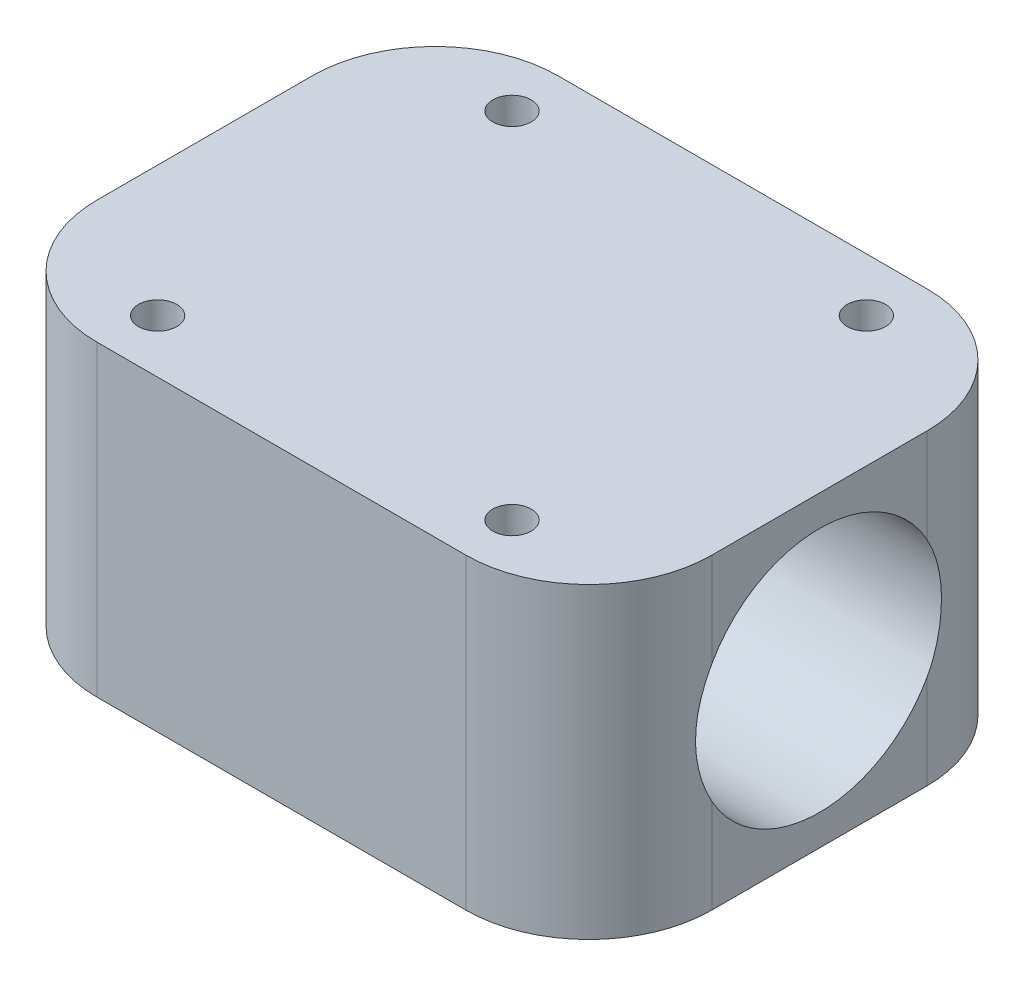
ISO-10303-21;
HEADER;
FILE_DESCRIPTION(('STEP AP214'),'2;1');
FILE_NAME('part.step','',(''),(''),'','','');
FILE_SCHEMA(('AUTOMOTIVE_DESIGN { 1 0 10303 214 1 1 1 1 }'));
ENDSEC;
DATA;
#1=APPLICATION_CONTEXT('core data for automotive mechanical design processes');
#2=APPLICATION_PROTOCOL_DEFINITION('international standard','automotive_design',2000,#1);
#3=PRODUCT_CONTEXT('',#1,'mechanical');
#4=PRODUCT('Part','Part','',(#3));
#5=PRODUCT_RELATED_PRODUCT_CATEGORY('part','',(#4));
#6=PRODUCT_DEFINITION_FORMATION('','',#4);
#7=PRODUCT_DEFINITION_CONTEXT('part definition',#1,'design');
#8=PRODUCT_DEFINITION('design','',#6,#7);
#9=PRODUCT_DEFINITION_SHAPE('','',#8);
#10=(LENGTH_UNIT() NAMED_UNIT(*) SI_UNIT(.MILLI.,.METRE.));
#11=(NAMED_UNIT(*) PLANE_ANGLE_UNIT() SI_UNIT($,.RADIAN.));
#12=(NAMED_UNIT(*) SI_UNIT($,.STERADIAN.) SOLID_ANGLE_UNIT());
#13=UNCERTAINTY_MEASURE_WITH_UNIT(LENGTH_MEASURE(1.E-05),#10,'distance_accuracy_value','');
#14=(GEOMETRIC_REPRESENTATION_CONTEXT(3) GLOBAL_UNCERTAINTY_ASSIGNED_CONTEXT((#13)) GLOBAL_UNIT_ASSIGNED_CONTEXT((#10,
#11,#12)) REPRESENTATION_CONTEXT('',''));
#15=CARTESIAN_POINT('',(0.,0.,0.));
#16=DIRECTION('',(0.,0.,1.));
#17=DIRECTION('',(1.,0.,0.));
#18=AXIS2_PLACEMENT_3D('',#15,#16,#17);
#19=CARTESIAN_POINT('',(-20.,20.,-6.99999999999995));
#20=DIRECTION('',(1.,0.,0.));
#21=DIRECTION('',(0.,0.,-1.));
#22=AXIS2_PLACEMENT_3D('',#19,#20,#21);
#23=PLANE('',#22);
#24=DIRECTION('',(0.,-1.,0.));
#25=VECTOR('',#24,1.);
#26=CARTESIAN_POINT('',(-20.,20.,-6.99999999999995));
#27=LINE('',#26,#25);
#28=CARTESIAN_POINT('',(-20.,20.,-6.99999999999995));
#29=VERTEX_POINT('',#28);
#30=CARTESIAN_POINT('',(-20.,13.8729833462075,-6.99999999999995));
#31=VERTEX_POINT('',#30);
#32=EDGE_CURVE('E139',#29,#31,#27,.T.);
#33=ORIENTED_EDGE('',*,*,#32,.T.);
#34=CARTESIAN_POINT('',(-20.,10.,0.));
#35=DIRECTION('',(1.,0.,0.));
#36=DIRECTION('',(0.,0.,-1.));
#37=AXIS2_PLACEMENT_3D('',#34,#35,#36);
#38=CIRCLE('',#37,8.);
#39=CARTESIAN_POINT('',(-20.,13.8729833462074,6.99999999999999));
#40=VERTEX_POINT('',#39);
#41=EDGE_CURVE('E124',#31,#40,#38,.T.);
#42=ORIENTED_EDGE('',*,*,#41,.T.);
#43=DIRECTION('',(0.,-1.,0.));
#44=VECTOR('',#43,1.);
#45=CARTESIAN_POINT('',(-20.,20.,6.99999999999994));
#46=LINE('',#45,#44);
#47=CARTESIAN_POINT('',(-20.,20.,6.99999999999994));
#48=VERTEX_POINT('',#47);
#49=EDGE_CURVE('E150',#48,#40,#46,.T.);
#50=ORIENTED_EDGE('',*,*,#49,.F.);
#51=DIRECTION('',(0.,0.,1.));
#52=VECTOR('',#51,1.);
#53=CARTESIAN_POINT('',(-20.,20.,-6.99999999999995));
#54=LINE('',#53,#52);
#55=EDGE_CURVE('E145',#29,#48,#54,.T.);
#56=ORIENTED_EDGE('',*,*,#55,.F.);
#57=EDGE_LOOP('',(#33,#42,#50,#56));
#58=FACE_BOUND('',#57,.T.);
#59=ADVANCED_FACE('F37',(#58),#23,.F.);
#60=CARTESIAN_POINT('',(20.,20.,-6.99999999999995));
#61=DIRECTION('',(-1.,0.,0.));
#62=DIRECTION('',(0.,0.,1.));
#63=AXIS2_PLACEMENT_3D('',#60,#61,#62);
#64=PLANE('',#63);
#65=DIRECTION('',(0.,-1.,0.));
#66=VECTOR('',#65,1.);
#67=CARTESIAN_POINT('',(20.,20.,6.99999999999994));
#68=LINE('',#67,#66);
#69=CARTESIAN_POINT('',(20.,20.,6.99999999999994));
#70=VERTEX_POINT('',#69);
#71=CARTESIAN_POINT('',(20.,13.8729833462075,6.99999999999994));
#72=VERTEX_POINT('',#71);
#73=EDGE_CURVE('E201',#70,#72,#68,.T.);
#74=ORIENTED_EDGE('',*,*,#73,.T.);
#75=CARTESIAN_POINT('',(20.,10.,0.));
#76=DIRECTION('',(1.,0.,0.));
#77=DIRECTION('',(0.,0.,-1.));
#78=AXIS2_PLACEMENT_3D('',#75,#76,#77);
#79=CIRCLE('',#78,8.);
#80=CARTESIAN_POINT('',(20.,13.8729833462075,-6.99999999999995));
#81=VERTEX_POINT('',#80);
#82=EDGE_CURVE('E235',#81,#72,#79,.T.);
#83=ORIENTED_EDGE('',*,*,#82,.F.);
#84=DIRECTION('',(0.,-1.,0.));
#85=VECTOR('',#84,1.);
#86=CARTESIAN_POINT('',(20.,20.,-6.99999999999995));
#87=LINE('',#86,#85);
#88=CARTESIAN_POINT('',(20.,20.,-6.99999999999995));
#89=VERTEX_POINT('',#88);
#90=EDGE_CURVE('E198',#89,#81,#87,.T.);
#91=ORIENTED_EDGE('',*,*,#90,.F.);
#92=DIRECTION('',(0.,0.,-1.));
#93=VECTOR('',#92,1.);
#94=CARTESIAN_POINT('',(20.,20.,-6.99999999999995));
#95=LINE('',#94,#93);
#96=EDGE_CURVE('E181',#70,#89,#95,.T.);
#97=ORIENTED_EDGE('',*,*,#96,.F.);
#98=EDGE_LOOP('',(#74,#83,#91,#97));
#99=FACE_BOUND('',#98,.T.);
#100=ADVANCED_FACE('F234',(#99),#64,.F.);
#101=CARTESIAN_POINT('',(12.,20.,-7.00000000000001));
#102=DIRECTION('',(0.,-1.,0.));
#103=DIRECTION('',(0.,0.,-1.));
#104=AXIS2_PLACEMENT_3D('',#101,#102,#103);
#105=PLANE('',#104);
#106=CARTESIAN_POINT('',(12.,20.,-7.00000000000001));
#107=DIRECTION('',(0.,1.,0.));
#108=DIRECTION('',(0.,0.,-1.));
#109=AXIS2_PLACEMENT_3D('',#106,#107,#108);
#110=CIRCLE('',#109,8.);
#111=CARTESIAN_POINT('',(11.9999999999999,20.,-15.));
#112=VERTEX_POINT('',#111);
#113=EDGE_CURVE('E197',#89,#112,#110,.T.);
#114=ORIENTED_EDGE('',*,*,#113,.T.);
#115=DIRECTION('',(-1.,0.,0.));
#116=VECTOR('',#115,1.);
#117=CARTESIAN_POINT('',(-11.9999999999999,20.,-15.));
#118=LINE('',#117,#116);
#119=CARTESIAN_POINT('',(-11.9999999999999,20.,-15.));
#120=VERTEX_POINT('',#119);
#121=EDGE_CURVE('E160',#112,#120,#118,.T.);
#122=ORIENTED_EDGE('',*,*,#121,.T.);
#123=CARTESIAN_POINT('',(-12.,20.,-7.00000000000001));
#124=DIRECTION('',(0.,1.,0.));
#125=DIRECTION('',(0.,0.,1.));
#126=AXIS2_PLACEMENT_3D('',#123,#124,#125);
#127=CIRCLE('',#126,8.);
#128=EDGE_CURVE('E223',#120,#29,#127,.T.);
#129=ORIENTED_EDGE('',*,*,#128,.T.);
#130=ORIENTED_EDGE('',*,*,#55,.T.);
#131=CARTESIAN_POINT('',(-12.,20.,6.99999999999999));
#132=DIRECTION('',(0.,1.,0.));
#133=DIRECTION('',(0.,0.,1.));
#134=AXIS2_PLACEMENT_3D('',#131,#132,#133);
#135=CIRCLE('',#134,8.);
#136=CARTESIAN_POINT('',(-12.,20.,15.));
#137=VERTEX_POINT('',#136);
#138=EDGE_CURVE('E217',#48,#137,#135,.T.);
#139=ORIENTED_EDGE('',*,*,#138,.T.);
#140=DIRECTION('',(1.,0.,0.));
#141=VECTOR('',#140,1.);
#142=CARTESIAN_POINT('',(-11.9999999999999,20.,15.));
#143=LINE('',#142,#141);
#144=CARTESIAN_POINT('',(12.,20.,15.));
#145=VERTEX_POINT('',#144);
#146=EDGE_CURVE('E219',#137,#145,#143,.T.);
#147=ORIENTED_EDGE('',*,*,#146,.T.);
#148=CARTESIAN_POINT('',(12.,20.,6.99999999999999));
#149=DIRECTION('',(0.,1.,0.));
#150=DIRECTION('',(0.,0.,1.));
#151=AXIS2_PLACEMENT_3D('',#148,#149,#150);
#152=CIRCLE('',#151,8.);
#153=EDGE_CURVE('E221',#145,#70,#152,.T.);
#154=ORIENTED_EDGE('',*,*,#153,.T.);
#155=ORIENTED_EDGE('',*,*,#96,.T.);
#156=EDGE_LOOP('',(#114,#122,#129,#130,#139,#147,#154,#155));
#157=FACE_BOUND('',#156,.T.);
#158=CARTESIAN_POINT('',(-11.5258405333407,20.,-11.5258405333407));
#159=DIRECTION('',(0.,1.,0.));
#160=DIRECTION('',(0.,0.,1.));
#161=AXIS2_PLACEMENT_3D('',#158,#159,#160);
#162=CIRCLE('',#161,1.25);
#163=CARTESIAN_POINT('',(-11.5258405333407,20.,-10.2758405333407));
#164=VERTEX_POINT('',#163);
#165=EDGE_CURVE('E173',#164,#164,#162,.T.);
#166=ORIENTED_EDGE('',*,*,#165,.F.);
#167=EDGE_LOOP('',(#166));
#168=FACE_BOUND('',#167,.T.);
#169=CARTESIAN_POINT('',(11.5258405333407,20.,-11.5258405333407));
#170=DIRECTION('',(0.,1.,0.));
#171=DIRECTION('',(0.,0.,1.));
#172=AXIS2_PLACEMENT_3D('',#169,#170,#171);
#173=CIRCLE('',#172,1.25);
#174=CARTESIAN_POINT('',(11.5258405333407,20.,-10.2758405333407));
#175=VERTEX_POINT('',#174);
#176=EDGE_CURVE('E327',#175,#175,#173,.T.);
#177=ORIENTED_EDGE('',*,*,#176,.F.);
#178=EDGE_LOOP('',(#177));
#179=FACE_BOUND('',#178,.T.);
#180=CARTESIAN_POINT('',(11.5258405333407,20.,11.5258405333407));
#181=DIRECTION('',(0.,1.,0.));
#182=DIRECTION('',(0.,0.,1.));
#183=AXIS2_PLACEMENT_3D('',#180,#181,#182);
#184=CIRCLE('',#183,1.25);
#185=CARTESIAN_POINT('',(11.5258405333407,20.,12.7758405333407));
#186=VERTEX_POINT('',#185);
#187=EDGE_CURVE('E321',#186,#186,#184,.T.);
#188=ORIENTED_EDGE('',*,*,#187,.F.);
#189=EDGE_LOOP('',(#188));
#190=FACE_BOUND('',#189,.T.);
#191=CARTESIAN_POINT('',(-11.5258405333407,20.,11.5258405333407));
#192=DIRECTION('',(0.,1.,0.));
#193=DIRECTION('',(0.,0.,1.));
#194=AXIS2_PLACEMENT_3D('',#191,#192,#193);
#195=CIRCLE('',#194,1.25);
#196=CARTESIAN_POINT('',(-11.5258405333407,20.,12.7758405333407));
#197=VERTEX_POINT('',#196);
#198=EDGE_CURVE('E314',#197,#197,#195,.T.);
#199=ORIENTED_EDGE('',*,*,#198,.F.);
#200=EDGE_LOOP('',(#199));
#201=FACE_BOUND('',#200,.T.);
#202=ADVANCED_FACE('F230',(#157,#168,#179,#190,#201),#105,.F.);
#203=CARTESIAN_POINT('',(12.,0.,-7.00000000000001));
#204=DIRECTION('',(0.,-1.,0.));
#205=DIRECTION('',(0.,0.,-1.));
#206=AXIS2_PLACEMENT_3D('',#203,#204,#205);
#207=PLANE('',#206);
#208=CARTESIAN_POINT('',(11.5258405333407,0.,11.5258405333407));
#209=DIRECTION('',(0.,1.,0.));
#210=DIRECTION('',(0.,0.,1.));
#211=AXIS2_PLACEMENT_3D('',#208,#209,#210);
#212=CIRCLE('',#211,1.25);
#213=CARTESIAN_POINT('',(11.5258405333407,0.,12.7758405333407));
#214=VERTEX_POINT('',#213);
#215=EDGE_CURVE('E319',#214,#214,#212,.T.);
#216=ORIENTED_EDGE('',*,*,#215,.T.);
#217=EDGE_LOOP('',(#216));
#218=FACE_BOUND('',#217,.T.);
#219=CARTESIAN_POINT('',(-11.5258405333407,0.,-11.5258405333407));
#220=DIRECTION('',(0.,1.,0.));
#221=DIRECTION('',(0.,0.,1.));
#222=AXIS2_PLACEMENT_3D('',#219,#220,#221);
#223=CIRCLE('',#222,1.25);
#224=CARTESIAN_POINT('',(-11.5258405333407,0.,-10.2758405333407));
#225=VERTEX_POINT('',#224);
#226=EDGE_CURVE('E178',#225,#225,#223,.T.);
#227=ORIENTED_EDGE('',*,*,#226,.T.);
#228=EDGE_LOOP('',(#227));
#229=FACE_BOUND('',#228,.T.);
#230=CARTESIAN_POINT('',(12.,0.,-7.00000000000001));
#231=DIRECTION('',(0.,1.,0.));
#232=DIRECTION('',(0.,0.,-1.));
#233=AXIS2_PLACEMENT_3D('',#230,#231,#232);
#234=CIRCLE('',#233,8.);
#235=CARTESIAN_POINT('',(20.,0.,-6.99999999999995));
#236=VERTEX_POINT('',#235);
#237=CARTESIAN_POINT('',(11.9999999999999,0.,-15.));
#238=VERTEX_POINT('',#237);
#239=EDGE_CURVE('E165',#236,#238,#234,.T.);
#240=ORIENTED_EDGE('',*,*,#239,.F.);
#241=DIRECTION('',(0.,0.,-1.));
#242=VECTOR('',#241,1.);
#243=CARTESIAN_POINT('',(20.,0.,-6.99999999999995));
#244=LINE('',#243,#242);
#245=CARTESIAN_POINT('',(20.,0.,6.99999999999994));
#246=VERTEX_POINT('',#245);
#247=EDGE_CURVE('E195',#246,#236,#244,.T.);
#248=ORIENTED_EDGE('',*,*,#247,.F.);
#249=CARTESIAN_POINT('',(12.,0.,6.99999999999999));
#250=DIRECTION('',(0.,1.,0.));
#251=DIRECTION('',(0.,0.,1.));
#252=AXIS2_PLACEMENT_3D('',#249,#250,#251);
#253=CIRCLE('',#252,8.);
#254=CARTESIAN_POINT('',(12.,0.,15.));
#255=VERTEX_POINT('',#254);
#256=EDGE_CURVE('E192',#255,#246,#253,.T.);
#257=ORIENTED_EDGE('',*,*,#256,.F.);
#258=DIRECTION('',(1.,0.,0.));
#259=VECTOR('',#258,1.);
#260=CARTESIAN_POINT('',(-11.9999999999999,0.,15.));
#261=LINE('',#260,#259);
#262=CARTESIAN_POINT('',(-12.,0.,15.));
#263=VERTEX_POINT('',#262);
#264=EDGE_CURVE('E190',#263,#255,#261,.T.);
#265=ORIENTED_EDGE('',*,*,#264,.F.);
#266=CARTESIAN_POINT('',(-12.,0.,6.99999999999999));
#267=DIRECTION('',(0.,1.,0.));
#268=DIRECTION('',(0.,0.,1.));
#269=AXIS2_PLACEMENT_3D('',#266,#267,#268);
#270=CIRCLE('',#269,8.);
#271=CARTESIAN_POINT('',(-20.,0.,6.99999999999994));
#272=VERTEX_POINT('',#271);
#273=EDGE_CURVE('E188',#272,#263,#270,.T.);
#274=ORIENTED_EDGE('',*,*,#273,.F.);
#275=DIRECTION('',(0.,0.,1.));
#276=VECTOR('',#275,1.);
#277=CARTESIAN_POINT('',(-20.,0.,-6.99999999999995));
#278=LINE('',#277,#276);
#279=CARTESIAN_POINT('',(-20.,0.,-6.99999999999995));
#280=VERTEX_POINT('',#279);
#281=EDGE_CURVE('E185',#280,#272,#278,.T.);
#282=ORIENTED_EDGE('',*,*,#281,.F.);
#283=CARTESIAN_POINT('',(-12.,0.,-7.00000000000001));
#284=DIRECTION('',(0.,1.,0.));
#285=DIRECTION('',(0.,0.,1.));
#286=AXIS2_PLACEMENT_3D('',#283,#284,#285);
#287=CIRCLE('',#286,8.);
#288=CARTESIAN_POINT('',(-11.9999999999999,0.,-15.));
#289=VERTEX_POINT('',#288);
#290=EDGE_CURVE('E175',#289,#280,#287,.T.);
#291=ORIENTED_EDGE('',*,*,#290,.F.);
#292=DIRECTION('',(-1.,0.,0.));
#293=VECTOR('',#292,1.);
#294=CARTESIAN_POINT('',(-11.9999999999999,0.,-15.));
#295=LINE('',#294,#293);
#296=EDGE_CURVE('E159',#238,#289,#295,.T.);
#297=ORIENTED_EDGE('',*,*,#296,.F.);
#298=EDGE_LOOP('',(#240,#248,#257,#265,#274,#282,#291,#297));
#299=FACE_BOUND('',#298,.T.);
#300=CARTESIAN_POINT('',(11.5258405333407,0.,-11.5258405333407));
#301=DIRECTION('',(0.,1.,0.));
#302=DIRECTION('',(0.,0.,1.));
#303=AXIS2_PLACEMENT_3D('',#300,#301,#302);
#304=CIRCLE('',#303,1.25);
#305=CARTESIAN_POINT('',(11.5258405333407,0.,-10.2758405333407));
#306=VERTEX_POINT('',#305);
#307=EDGE_CURVE('E324',#306,#306,#304,.T.);
#308=ORIENTED_EDGE('',*,*,#307,.T.);
#309=EDGE_LOOP('',(#308));
#310=FACE_BOUND('',#309,.T.);
#311=CARTESIAN_POINT('',(-11.5258405333407,0.,11.5258405333407));
#312=DIRECTION('',(0.,1.,0.));
#313=DIRECTION('',(0.,0.,1.));
#314=AXIS2_PLACEMENT_3D('',#311,#312,#313);
#315=CIRCLE('',#314,1.25);
#316=CARTESIAN_POINT('',(-11.5258405333407,0.,12.7758405333407));
#317=VERTEX_POINT('',#316);
#318=EDGE_CURVE('E312',#317,#317,#315,.T.);
#319=ORIENTED_EDGE('',*,*,#318,.T.);
#320=EDGE_LOOP('',(#319));
#321=FACE_BOUND('',#320,.T.);
#322=ADVANCED_FACE('F241',(#218,#229,#299,#310,#321),#207,.T.);
#323=CARTESIAN_POINT('',(12.,20.,-7.00000000000001));
#324=DIRECTION('',(0.,-1.,0.));
#325=DIRECTION('',(0.,0.,-1.));
#326=AXIS2_PLACEMENT_3D('',#323,#324,#325);
#327=CYLINDRICAL_SURFACE('',#326,8.);
#328=ORIENTED_EDGE('',*,*,#90,.T.);
#329=CARTESIAN_POINT('',(20.,13.8729833462075,-6.99999999999995));
#330=CARTESIAN_POINT('',(19.999955125017,13.6763221820204,-7.10883612041854));
#331=CARTESIAN_POINT('',(19.9977768995966,13.4750774520624,-7.20933000196342));
#332=CARTESIAN_POINT('',(19.9908807909294,13.064905879238,-7.39301974211418));
#333=CARTESIAN_POINT('',(19.9861631768253,12.8559798526767,-7.47621743259982));
#334=CARTESIAN_POINT('',(19.9759228974455,12.4322320696692,-7.62460422395473));
#335=CARTESIAN_POINT('',(19.9704015493122,12.2174204172454,-7.68982229290339));
#336=CARTESIAN_POINT('',(19.9599000354582,11.7830647384255,-7.80198581717139));
#337=CARTESIAN_POINT('',(19.9549198675169,11.5635207314506,-7.84893134746511));
#338=CARTESIAN_POINT('',(19.9465215160614,11.1210352182704,-7.92424713358336));
#339=CARTESIAN_POINT('',(19.9431047356728,10.8980908449444,-7.95260071314983));
#340=CARTESIAN_POINT('',(19.9384735134743,10.4505820689764,-7.99045675307186));
#341=CARTESIAN_POINT('',(19.9372590819675,10.2260176587603,-7.99995912523675));
#342=CARTESIAN_POINT('',(19.9372488175885,9.77688484423645,-8.00004061149689));
#343=CARTESIAN_POINT('',(19.9384529899331,9.55231643992103,-7.99061968477456));
#344=CARTESIAN_POINT('',(19.9430655380601,9.1047927305723,-7.95292585001845));
#345=CARTESIAN_POINT('',(19.9464739045844,8.88183741876765,-7.92465302116658));
#346=CARTESIAN_POINT('',(19.9548635509727,8.43908693712663,-7.84945721346348));
#347=CARTESIAN_POINT('',(19.9598451011367,8.21929231714197,-7.80253102928504));
#348=CARTESIAN_POINT('',(19.970354503264,7.78444047828594,-7.69036567952335));
#349=CARTESIAN_POINT('',(19.9758823581224,7.5693832845276,-7.62512641688798));
#350=CARTESIAN_POINT('',(19.9861373506157,7.14515232911403,-7.47665712877295));
#351=CARTESIAN_POINT('',(19.9908631667068,6.93598874241325,-7.39339791503544));
#352=CARTESIAN_POINT('',(19.9977720852807,6.52535728497314,-7.20954713890403));
#353=CARTESIAN_POINT('',(19.9999549205315,6.32389022518368,-7.10895375620331));
#354=CARTESIAN_POINT('',(20.,6.12701665379248,-6.99999999999995));
#355=B_SPLINE_CURVE_WITH_KNOTS('',3,(#329,#330,#331,#332,#333,#334,#335,#336,#337,#338,#339,
#340,#341,#342,#343,#344,#345,#346,#347,#348,#349,#350,#351,#352,#353,#354),.UNSPECIFIED.,.F.,
.F.,(4,2,2,2,2,2,2,2,2,2,2,2,4),(0.,0.674057468568093,1.34804350973321,2.02093721826604,
2.69382816580739,3.3673218477823,4.04081868052177,4.71431696599638,5.38781242265633,
6.06142366047946,6.73503846824525,7.40975265678092,8.08453774206085),.UNSPECIFIED.);
#356=CARTESIAN_POINT('',(20.,6.12701665379248,-6.99999999999995));
#357=VERTEX_POINT('',#356);
#358=EDGE_CURVE('E143',#81,#357,#355,.T.);
#359=ORIENTED_EDGE('',*,*,#358,.T.);
#360=EDGE_CURVE('E169',#357,#236,#87,.T.);
#361=ORIENTED_EDGE('',*,*,#360,.T.);
#362=ORIENTED_EDGE('',*,*,#239,.T.);
#363=DIRECTION('',(0.,-1.,0.));
#364=VECTOR('',#363,1.);
#365=CARTESIAN_POINT('',(11.9999999999999,20.,-15.));
#366=LINE('',#365,#364);
#367=EDGE_CURVE('E46',#112,#238,#366,.T.);
#368=ORIENTED_EDGE('',*,*,#367,.F.);
#369=ORIENTED_EDGE('',*,*,#113,.F.);
#370=EDGE_LOOP('',(#328,#359,#361,#362,#368,#369));
#371=FACE_BOUND('',#370,.T.);
#372=ADVANCED_FACE('F39',(#371),#327,.T.);
#373=CARTESIAN_POINT('',(-11.9999999999999,20.,-15.));
#374=DIRECTION('',(0.,0.,1.));
#375=DIRECTION('',(1.,0.,0.));
#376=AXIS2_PLACEMENT_3D('',#373,#374,#375);
#377=PLANE('',#376);
#378=ORIENTED_EDGE('',*,*,#296,.T.);
#379=DIRECTION('',(0.,-1.,0.));
#380=VECTOR('',#379,1.);
#381=CARTESIAN_POINT('',(-11.9999999999999,20.,-15.));
#382=LINE('',#381,#380);
#383=EDGE_CURVE('E146',#120,#289,#382,.T.);
#384=ORIENTED_EDGE('',*,*,#383,.F.);
#385=ORIENTED_EDGE('',*,*,#121,.F.);
#386=ORIENTED_EDGE('',*,*,#367,.T.);
#387=EDGE_LOOP('',(#378,#384,#385,#386));
#388=FACE_BOUND('',#387,.T.);
#389=ADVANCED_FACE('F157',(#388),#377,.F.);
#390=CARTESIAN_POINT('',(-12.,20.,-7.00000000000001));
#391=DIRECTION('',(0.,-1.,0.));
#392=DIRECTION('',(0.,0.,-1.));
#393=AXIS2_PLACEMENT_3D('',#390,#391,#392);
#394=CYLINDRICAL_SURFACE('',#393,8.);
#395=CARTESIAN_POINT('',(-20.,6.1270166537925,-6.99999999999995));
#396=VERTEX_POINT('',#395);
#397=EDGE_CURVE('E142',#396,#280,#27,.T.);
#398=ORIENTED_EDGE('',*,*,#397,.F.);
#399=CARTESIAN_POINT('',(-20.,6.12701665379249,-6.99999999999995));
#400=CARTESIAN_POINT('',(-19.9999551250169,6.32367781797963,-7.10883612041854));
#401=CARTESIAN_POINT('',(-19.9977768995966,6.52492254793763,-7.20933000196342));
#402=CARTESIAN_POINT('',(-19.9908807909294,6.93509412076203,-7.39301974211418));
#403=CARTESIAN_POINT('',(-19.9861631768252,7.1440201473233,-7.47621743259982));
#404=CARTESIAN_POINT('',(-19.9759228974455,7.56776793033085,-7.62460422395473));
#405=CARTESIAN_POINT('',(-19.9704015493122,7.7825795827546,-7.68982229290339));
#406=CARTESIAN_POINT('',(-19.9599000354581,8.21693526157455,-7.80198581717138));
#407=CARTESIAN_POINT('',(-19.9549198675169,8.43647926854943,-7.84893134746511));
#408=CARTESIAN_POINT('',(-19.9465215160614,8.87896478172956,-7.92424713358335));
#409=CARTESIAN_POINT('',(-19.9431047356728,9.10190915505558,-7.95260071314982));
#410=CARTESIAN_POINT('',(-19.9384735134743,9.54941793102363,-7.99045675307186));
#411=CARTESIAN_POINT('',(-19.9372590819675,9.77398234123967,-7.99995912523675));
#412=CARTESIAN_POINT('',(-19.9372488175885,10.2231151557636,-8.00004061149689));
#413=CARTESIAN_POINT('',(-19.9384529899331,10.447683560079,-7.99061968477455));
#414=CARTESIAN_POINT('',(-19.9430655380601,10.8952072694277,-7.95292585001845));
#415=CARTESIAN_POINT('',(-19.9464739045844,11.1181625812324,-7.92465302116658));
#416=CARTESIAN_POINT('',(-19.9548635509727,11.5609130628734,-7.84945721346348));
#417=CARTESIAN_POINT('',(-19.9598451011367,11.780707682858,-7.80253102928503));
#418=CARTESIAN_POINT('',(-19.970354503264,12.2155595217141,-7.69036567952335));
#419=CARTESIAN_POINT('',(-19.9758823581224,12.4306167154724,-7.62512641688797));
#420=CARTESIAN_POINT('',(-19.9861373506157,12.854847670886,-7.47665712877294));
#421=CARTESIAN_POINT('',(-19.9908631667068,13.0640112575867,-7.39339791503543));
#422=CARTESIAN_POINT('',(-19.9977720852807,13.4746427150269,-7.20954713890403));
#423=CARTESIAN_POINT('',(-19.9999549205315,13.6761097748163,-7.10895375620331));
#424=CARTESIAN_POINT('',(-20.,13.8729833462075,-6.99999999999995));
#425=B_SPLINE_CURVE_WITH_KNOTS('',3,(#399,#400,#401,#402,#403,#404,#405,#406,#407,#408,#409,
#410,#411,#412,#413,#414,#415,#416,#417,#418,#419,#420,#421,#422,#423,#424),.UNSPECIFIED.,.F.,
.F.,(4,2,2,2,2,2,2,2,2,2,2,2,4),(0.,0.674057468568091,1.34804350973321,2.02093721826604,
2.69382816580739,3.3673218477823,4.04081868052177,4.71431696599638,5.38781242265632,
6.06142366047945,6.73503846824524,7.4097526567809,8.08453774206083),.UNSPECIFIED.);
#426=EDGE_CURVE('E127',#396,#31,#425,.T.);
#427=ORIENTED_EDGE('',*,*,#426,.T.);
#428=ORIENTED_EDGE('',*,*,#32,.F.);
#429=ORIENTED_EDGE('',*,*,#128,.F.);
#430=ORIENTED_EDGE('',*,*,#383,.T.);
#431=ORIENTED_EDGE('',*,*,#290,.T.);
#432=EDGE_LOOP('',(#398,#427,#428,#429,#430,#431));
#433=FACE_BOUND('',#432,.T.);
#434=ADVANCED_FACE('F137',(#433),#394,.T.);
#435=CARTESIAN_POINT('',(-20.,6.12701665379257,6.99999999999994));
#436=VERTEX_POINT('',#435);
#437=EDGE_CURVE('E208',#436,#272,#46,.T.);
#438=ORIENTED_EDGE('',*,*,#437,.F.);
#439=EDGE_CURVE('E53',#436,#396,#38,.T.);
#440=ORIENTED_EDGE('',*,*,#439,.T.);
#441=ORIENTED_EDGE('',*,*,#397,.T.);
#442=ORIENTED_EDGE('',*,*,#281,.T.);
#443=EDGE_LOOP('',(#438,#440,#441,#442));
#444=FACE_BOUND('',#443,.T.);
#445=ADVANCED_FACE('F245',(#444),#23,.F.);
#446=CARTESIAN_POINT('',(-12.,20.,6.99999999999999));
#447=DIRECTION('',(0.,-1.,0.));
#448=DIRECTION('',(0.,0.,-1.));
#449=AXIS2_PLACEMENT_3D('',#446,#447,#448);
#450=CYLINDRICAL_SURFACE('',#449,8.);
#451=ORIENTED_EDGE('',*,*,#49,.T.);
#452=CARTESIAN_POINT('',(-20.,13.8729833462075,6.99999999999994));
#453=CARTESIAN_POINT('',(-19.9999551250169,13.6763221820204,7.10883612041853));
#454=CARTESIAN_POINT('',(-19.9977768995966,13.4750774520624,7.20933000196341));
#455=CARTESIAN_POINT('',(-19.9908807909294,13.064905879238,7.39301974211417));
#456=CARTESIAN_POINT('',(-19.9861631768252,12.8559798526767,7.47621743259981));
#457=CARTESIAN_POINT('',(-19.9759228974455,12.4322320696692,7.62460422395472));
#458=CARTESIAN_POINT('',(-19.9704015493122,12.2174204172454,7.68982229290338));
#459=CARTESIAN_POINT('',(-19.9599000354581,11.7830647384255,7.80198581717138));
#460=CARTESIAN_POINT('',(-19.9549198675169,11.5635207314506,7.8489313474651));
#461=CARTESIAN_POINT('',(-19.9465215160614,11.1210352182705,7.92424713358334));
#462=CARTESIAN_POINT('',(-19.9431047356728,10.8980908449444,7.95260071314982));
#463=CARTESIAN_POINT('',(-19.9384735134743,10.4505820689764,7.99045675307185));
#464=CARTESIAN_POINT('',(-19.9372590819675,10.2260176587604,7.99995912523675));
#465=CARTESIAN_POINT('',(-19.9372488175884,9.77688484423647,8.00004061149689));
#466=CARTESIAN_POINT('',(-19.9384529899331,9.55231643992105,7.99061968477455));
#467=CARTESIAN_POINT('',(-19.9430655380601,9.10479273057232,7.95292585001844));
#468=CARTESIAN_POINT('',(-19.9464739045844,8.88183741876767,7.92465302116657));
#469=CARTESIAN_POINT('',(-19.9548635509726,8.43908693712665,7.84945721346348));
#470=CARTESIAN_POINT('',(-19.9598451011367,8.21929231714198,7.80253102928503));
#471=CARTESIAN_POINT('',(-19.970354503264,7.78444047828595,7.69036567952335));
#472=CARTESIAN_POINT('',(-19.9758823581224,7.56938328452761,7.62512641688797));
#473=CARTESIAN_POINT('',(-19.9861373506157,7.14515232911403,7.47665712877294));
#474=CARTESIAN_POINT('',(-19.9908631667068,6.93598874241325,7.39339791503543));
#475=CARTESIAN_POINT('',(-19.9977720852807,6.52535728497313,7.20954713890402));
#476=CARTESIAN_POINT('',(-19.9999549205314,6.32389022518368,7.1089537562033));
#477=CARTESIAN_POINT('',(-20.,6.12701665379247,6.99999999999994));
#478=B_SPLINE_CURVE_WITH_KNOTS('',3,(#452,#453,#454,#455,#456,#457,#458,#459,#460,#461,#462,
#463,#464,#465,#466,#467,#468,#469,#470,#471,#472,#473,#474,#475,#476,#477),.UNSPECIFIED.,.F.,
.F.,(4,2,2,2,2,2,2,2,2,2,2,2,4),(0.,0.674057468568094,1.34804350973321,2.02093721826604,
2.69382816580739,3.36732184778229,4.04081868052177,4.71431696599638,5.38781242265632,
6.06142366047947,6.73503846824526,7.40975265678094,8.08453774206087),.UNSPECIFIED.);
#479=EDGE_CURVE('E128',#40,#436,#478,.T.);
#480=ORIENTED_EDGE('',*,*,#479,.T.);
#481=ORIENTED_EDGE('',*,*,#437,.T.);
#482=ORIENTED_EDGE('',*,*,#273,.T.);
#483=DIRECTION('',(0.,-1.,0.));
#484=VECTOR('',#483,1.);
#485=CARTESIAN_POINT('',(-12.,20.,15.));
#486=LINE('',#485,#484);
#487=EDGE_CURVE('E206',#137,#263,#486,.T.);
#488=ORIENTED_EDGE('',*,*,#487,.F.);
#489=ORIENTED_EDGE('',*,*,#138,.F.);
#490=EDGE_LOOP('',(#451,#480,#481,#482,#488,#489));
#491=FACE_BOUND('',#490,.T.);
#492=ADVANCED_FACE('F216',(#491),#450,.T.);
#493=CARTESIAN_POINT('',(-11.9999999999999,20.,15.));
#494=DIRECTION('',(0.,0.,-1.));
#495=DIRECTION('',(-1.,0.,0.));
#496=AXIS2_PLACEMENT_3D('',#493,#494,#495);
#497=PLANE('',#496);
#498=ORIENTED_EDGE('',*,*,#264,.T.);
#499=DIRECTION('',(0.,-1.,0.));
#500=VECTOR('',#499,1.);
#501=CARTESIAN_POINT('',(12.,20.,15.));
#502=LINE('',#501,#500);
#503=EDGE_CURVE('E204',#145,#255,#502,.T.);
#504=ORIENTED_EDGE('',*,*,#503,.F.);
#505=ORIENTED_EDGE('',*,*,#146,.F.);
#506=ORIENTED_EDGE('',*,*,#487,.T.);
#507=EDGE_LOOP('',(#498,#504,#505,#506));
#508=FACE_BOUND('',#507,.T.);
#509=ADVANCED_FACE('F299',(#508),#497,.F.);
#510=CARTESIAN_POINT('',(12.,20.,6.99999999999999));
#511=DIRECTION('',(0.,-1.,0.));
#512=DIRECTION('',(0.,0.,-1.));
#513=AXIS2_PLACEMENT_3D('',#510,#511,#512);
#514=CYLINDRICAL_SURFACE('',#513,8.);
#515=CARTESIAN_POINT('',(20.,6.12701665379248,6.99999999999994));
#516=VERTEX_POINT('',#515);
#517=EDGE_CURVE('E200',#516,#246,#68,.T.);
#518=ORIENTED_EDGE('',*,*,#517,.F.);
#519=CARTESIAN_POINT('',(20.,6.12701665379248,6.99999999999994));
#520=CARTESIAN_POINT('',(19.999955125017,6.32367781797962,7.10883612041853));
#521=CARTESIAN_POINT('',(19.9977768995966,6.52492254793762,7.20933000196341));
#522=CARTESIAN_POINT('',(19.9908807909294,6.93509412076203,7.39301974211417));
#523=CARTESIAN_POINT('',(19.9861631768253,7.14402014732329,7.47621743259981));
#524=CARTESIAN_POINT('',(19.9759228974455,7.56776793033085,7.62460422395472));
#525=CARTESIAN_POINT('',(19.9704015493122,7.7825795827546,7.68982229290338));
#526=CARTESIAN_POINT('',(19.9599000354582,8.21693526157454,7.80198581717138));
#527=CARTESIAN_POINT('',(19.9549198675169,8.43647926854942,7.8489313474651));
#528=CARTESIAN_POINT('',(19.9465215160614,8.87896478172956,7.92424713358334));
#529=CARTESIAN_POINT('',(19.9431047356728,9.10190915505557,7.95260071314981));
#530=CARTESIAN_POINT('',(19.9384735134743,9.54941793102362,7.99045675307185));
#531=CARTESIAN_POINT('',(19.9372590819675,9.77398234123966,7.99995912523674));
#532=CARTESIAN_POINT('',(19.9372488175885,10.2231151557635,8.00004061149688));
#533=CARTESIAN_POINT('',(19.9384529899331,10.447683560079,7.99061968477455));
#534=CARTESIAN_POINT('',(19.9430655380601,10.8952072694277,7.95292585001844));
#535=CARTESIAN_POINT('',(19.9464739045844,11.1181625812323,7.92465302116657));
#536=CARTESIAN_POINT('',(19.9548635509727,11.5609130628734,7.84945721346347));
#537=CARTESIAN_POINT('',(19.9598451011367,11.780707682858,7.80253102928503));
#538=CARTESIAN_POINT('',(19.970354503264,12.2155595217141,7.69036567952334));
#539=CARTESIAN_POINT('',(19.9758823581224,12.4306167154724,7.62512641688797));
#540=CARTESIAN_POINT('',(19.9861373506157,12.854847670886,7.47665712877294));
#541=CARTESIAN_POINT('',(19.9908631667068,13.0640112575867,7.39339791503543));
#542=CARTESIAN_POINT('',(19.9977720852807,13.4746427150269,7.20954713890402));
#543=CARTESIAN_POINT('',(19.9999549205315,13.6761097748163,7.1089537562033));
#544=CARTESIAN_POINT('',(20.,13.8729833462075,6.99999999999994));
#545=B_SPLINE_CURVE_WITH_KNOTS('',3,(#519,#520,#521,#522,#523,#524,#525,#526,#527,#528,#529,
#530,#531,#532,#533,#534,#535,#536,#537,#538,#539,#540,#541,#542,#543,#544),.UNSPECIFIED.,.F.,
.F.,(4,2,2,2,2,2,2,2,2,2,2,2,4),(0.,0.674057468568093,1.34804350973321,2.02093721826604,
2.69382816580739,3.3673218477823,4.04081868052177,4.71431696599637,5.38781242265632,
6.06142366047946,6.73503846824525,7.40975265678091,8.08453774206084),.UNSPECIFIED.);
#546=EDGE_CURVE('E61',#516,#72,#545,.T.);
#547=ORIENTED_EDGE('',*,*,#546,.T.);
#548=ORIENTED_EDGE('',*,*,#73,.F.);
#549=ORIENTED_EDGE('',*,*,#153,.F.);
#550=ORIENTED_EDGE('',*,*,#503,.T.);
#551=ORIENTED_EDGE('',*,*,#256,.T.);
#552=EDGE_LOOP('',(#518,#547,#548,#549,#550,#551));
#553=FACE_BOUND('',#552,.T.);
#554=ADVANCED_FACE('F260',(#553),#514,.T.);
#555=ORIENTED_EDGE('',*,*,#360,.F.);
#556=CARTESIAN_POINT('',(20.,10.,0.));
#557=DIRECTION('',(-1.,0.,0.));
#558=DIRECTION('',(0.,0.,1.));
#559=AXIS2_PLACEMENT_3D('',#556,#557,#558);
#560=CIRCLE('',#559,8.);
#561=EDGE_CURVE('E11',#357,#516,#560,.T.);
#562=ORIENTED_EDGE('',*,*,#561,.T.);
#563=ORIENTED_EDGE('',*,*,#517,.T.);
#564=ORIENTED_EDGE('',*,*,#247,.T.);
#565=EDGE_LOOP('',(#555,#562,#563,#564));
#566=FACE_BOUND('',#565,.T.);
#567=ADVANCED_FACE('F294',(#566),#64,.F.);
#568=CARTESIAN_POINT('',(-11.5258405333407,20.,-11.5258405333407));
#569=DIRECTION('',(0.,-1.,0.));
#570=DIRECTION('',(0.,0.,-1.));
#571=AXIS2_PLACEMENT_3D('',#568,#569,#570);
#572=CYLINDRICAL_SURFACE('',#571,1.25);
#573=ORIENTED_EDGE('',*,*,#165,.T.);
#574=EDGE_LOOP('',(#573));
#575=FACE_BOUND('',#574,.T.);
#576=ORIENTED_EDGE('',*,*,#226,.F.);
#577=EDGE_LOOP('',(#576));
#578=FACE_BOUND('',#577,.T.);
#579=ADVANCED_FACE('F336',(#575,#578),#572,.F.);
#580=CARTESIAN_POINT('',(11.5258405333407,20.,-11.5258405333407));
#581=DIRECTION('',(0.,-1.,0.));
#582=DIRECTION('',(0.,0.,-1.));
#583=AXIS2_PLACEMENT_3D('',#580,#581,#582);
#584=CYLINDRICAL_SURFACE('',#583,1.25);
#585=ORIENTED_EDGE('',*,*,#176,.T.);
#586=EDGE_LOOP('',(#585));
#587=FACE_BOUND('',#586,.T.);
#588=ORIENTED_EDGE('',*,*,#307,.F.);
#589=EDGE_LOOP('',(#588));
#590=FACE_BOUND('',#589,.T.);
#591=ADVANCED_FACE('F333',(#587,#590),#584,.F.);
#592=CARTESIAN_POINT('',(11.5258405333407,20.,11.5258405333407));
#593=DIRECTION('',(0.,-1.,0.));
#594=DIRECTION('',(0.,0.,-1.));
#595=AXIS2_PLACEMENT_3D('',#592,#593,#594);
#596=CYLINDRICAL_SURFACE('',#595,1.25);
#597=ORIENTED_EDGE('',*,*,#187,.T.);
#598=EDGE_LOOP('',(#597));
#599=FACE_BOUND('',#598,.T.);
#600=ORIENTED_EDGE('',*,*,#215,.F.);
#601=EDGE_LOOP('',(#600));
#602=FACE_BOUND('',#601,.T.);
#603=ADVANCED_FACE('F335',(#599,#602),#596,.F.);
#604=CARTESIAN_POINT('',(-11.5258405333407,20.,11.5258405333407));
#605=DIRECTION('',(0.,-1.,0.));
#606=DIRECTION('',(0.,0.,-1.));
#607=AXIS2_PLACEMENT_3D('',#604,#605,#606);
#608=CYLINDRICAL_SURFACE('',#607,1.25);
#609=ORIENTED_EDGE('',*,*,#198,.T.);
#610=EDGE_LOOP('',(#609));
#611=FACE_BOUND('',#610,.T.);
#612=ORIENTED_EDGE('',*,*,#318,.F.);
#613=EDGE_LOOP('',(#612));
#614=FACE_BOUND('',#613,.T.);
#615=ADVANCED_FACE('F267',(#611,#614),#608,.F.);
#616=CARTESIAN_POINT('',(-20.,10.,0.));
#617=DIRECTION('',(1.,0.,0.));
#618=DIRECTION('',(0.,0.,-1.));
#619=AXIS2_PLACEMENT_3D('',#616,#617,#618);
#620=CYLINDRICAL_SURFACE('',#619,8.);
#621=ORIENTED_EDGE('',*,*,#439,.F.);
#622=ORIENTED_EDGE('',*,*,#479,.F.);
#623=ORIENTED_EDGE('',*,*,#41,.F.);
#624=ORIENTED_EDGE('',*,*,#426,.F.);
#625=EDGE_LOOP('',(#621,#622,#623,#624));
#626=FACE_BOUND('',#625,.T.);
#627=ORIENTED_EDGE('',*,*,#82,.T.);
#628=ORIENTED_EDGE('',*,*,#546,.F.);
#629=ORIENTED_EDGE('',*,*,#561,.F.);
#630=ORIENTED_EDGE('',*,*,#358,.F.);
#631=EDGE_LOOP('',(#627,#628,#629,#630));
#632=FACE_BOUND('',#631,.T.);
#633=ADVANCED_FACE('F126',(#626,#632),#620,.F.);
#634=CLOSED_SHELL('',(#59,#100,#202,#322,#372,#389,#434,#445,#492,#509,#554,#567,#579,#591,#603,
#615,#633));
#635=MANIFOLD_SOLID_BREP('B2',#634);
#636=ADVANCED_BREP_SHAPE_REPRESENTATION('',(#18,#635),#14);
#637=SHAPE_DEFINITION_REPRESENTATION(#9,#636);
ENDSEC;
END-ISO-10303-21;
